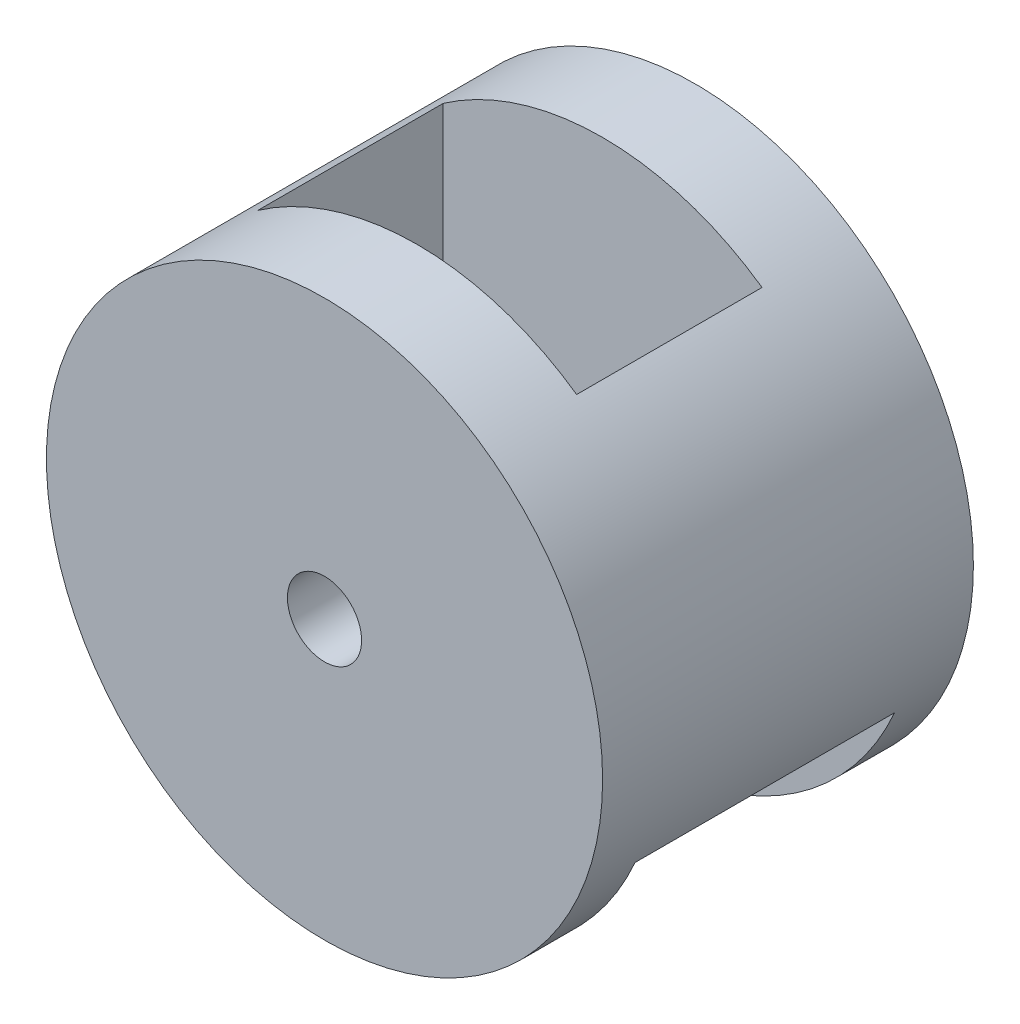
ISO-10303-21;
HEADER;
FILE_DESCRIPTION(('STEP AP214'),'2;1');
FILE_NAME('part.step','',(''),(''),'','','');
FILE_SCHEMA(('AUTOMOTIVE_DESIGN { 1 0 10303 214 1 1 1 1 }'));
ENDSEC;
DATA;
#1=APPLICATION_CONTEXT('core data for automotive mechanical design processes');
#2=APPLICATION_PROTOCOL_DEFINITION('international standard','automotive_design',2000,#1);
#3=PRODUCT_CONTEXT('',#1,'mechanical');
#4=PRODUCT('Part','Part','',(#3));
#5=PRODUCT_RELATED_PRODUCT_CATEGORY('part','',(#4));
#6=PRODUCT_DEFINITION_FORMATION('','',#4);
#7=PRODUCT_DEFINITION_CONTEXT('part definition',#1,'design');
#8=PRODUCT_DEFINITION('design','',#6,#7);
#9=PRODUCT_DEFINITION_SHAPE('','',#8);
#10=(LENGTH_UNIT() NAMED_UNIT(*) SI_UNIT(.MILLI.,.METRE.));
#11=(NAMED_UNIT(*) PLANE_ANGLE_UNIT() SI_UNIT($,.RADIAN.));
#12=(NAMED_UNIT(*) SI_UNIT($,.STERADIAN.) SOLID_ANGLE_UNIT());
#13=UNCERTAINTY_MEASURE_WITH_UNIT(LENGTH_MEASURE(1.E-05),#10,'distance_accuracy_value','');
#14=(GEOMETRIC_REPRESENTATION_CONTEXT(3) GLOBAL_UNCERTAINTY_ASSIGNED_CONTEXT((#13)) GLOBAL_UNIT_ASSIGNED_CONTEXT((#10,
#11,#12)) REPRESENTATION_CONTEXT('',''));
#15=CARTESIAN_POINT('',(0.,0.,0.));
#16=DIRECTION('',(0.,0.,1.));
#17=DIRECTION('',(1.,0.,0.));
#18=AXIS2_PLACEMENT_3D('',#15,#16,#17);
#19=CARTESIAN_POINT('',(0.,0.,10.));
#20=DIRECTION('',(0.,0.,-1.));
#21=DIRECTION('',(-1.,0.,0.));
#22=AXIS2_PLACEMENT_3D('',#19,#20,#21);
#23=CYLINDRICAL_SURFACE('',#22,7.5);
#24=CARTESIAN_POINT('',(0.,0.,7.5));
#25=DIRECTION('',(0.,0.,-1.));
#26=DIRECTION('',(-1.,0.,0.));
#27=AXIS2_PLACEMENT_3D('',#24,#25,#26);
#28=CIRCLE('',#27,7.5);
#29=CARTESIAN_POINT('',(-4.3,6.14491659829489,7.5));
#30=VERTEX_POINT('',#29);
#31=CARTESIAN_POINT('',(4.3,6.14491659829489,7.5));
#32=VERTEX_POINT('',#31);
#33=EDGE_CURVE('E153',#30,#32,#28,.T.);
#34=ORIENTED_EDGE('',*,*,#33,.F.);
#35=DIRECTION('',(0.,0.,-1.));
#36=VECTOR('',#35,1.);
#37=CARTESIAN_POINT('',(-4.3,6.14491659829489,7.5));
#38=LINE('',#37,#36);
#39=CARTESIAN_POINT('',(-4.3,6.14491659829489,2.5));
#40=VERTEX_POINT('',#39);
#41=EDGE_CURVE('E162',#30,#40,#38,.T.);
#42=ORIENTED_EDGE('',*,*,#41,.T.);
#43=CARTESIAN_POINT('',(0.,0.,2.5));
#44=DIRECTION('',(0.,0.,-1.));
#45=DIRECTION('',(-1.,0.,0.));
#46=AXIS2_PLACEMENT_3D('',#43,#44,#45);
#47=CIRCLE('',#46,7.5);
#48=CARTESIAN_POINT('',(4.3,6.14491659829489,2.5));
#49=VERTEX_POINT('',#48);
#50=EDGE_CURVE('E165',#40,#49,#47,.T.);
#51=ORIENTED_EDGE('',*,*,#50,.T.);
#52=DIRECTION('',(0.,0.,-1.));
#53=VECTOR('',#52,1.);
#54=CARTESIAN_POINT('',(4.3,6.14491659829489,7.5));
#55=LINE('',#54,#53);
#56=EDGE_CURVE('E175',#32,#49,#55,.T.);
#57=ORIENTED_EDGE('',*,*,#56,.F.);
#58=EDGE_LOOP('',(#34,#42,#51,#57));
#59=FACE_BOUND('',#58,.T.);
#60=CARTESIAN_POINT('',(0.,0.,10.));
#61=DIRECTION('',(0.,0.,1.));
#62=DIRECTION('',(1.,0.,0.));
#63=AXIS2_PLACEMENT_3D('',#60,#61,#62);
#64=CIRCLE('',#63,7.5);
#65=CARTESIAN_POINT('',(7.5,0.,10.));
#66=VERTEX_POINT('',#65);
#67=EDGE_CURVE('E11',#66,#66,#64,.T.);
#68=ORIENTED_EDGE('',*,*,#67,.F.);
#69=EDGE_LOOP('',(#68));
#70=FACE_BOUND('',#69,.T.);
#71=CARTESIAN_POINT('',(0.,0.,0.));
#72=DIRECTION('',(0.,0.,1.));
#73=DIRECTION('',(1.,0.,0.));
#74=AXIS2_PLACEMENT_3D('',#71,#72,#73);
#75=CIRCLE('',#74,7.5);
#76=CARTESIAN_POINT('',(7.5,0.,0.));
#77=VERTEX_POINT('',#76);
#78=EDGE_CURVE('E41',#77,#77,#75,.T.);
#79=ORIENTED_EDGE('',*,*,#78,.T.);
#80=EDGE_LOOP('',(#79));
#81=FACE_BOUND('',#80,.T.);
#82=CARTESIAN_POINT('',(0.,0.,8.5));
#83=DIRECTION('',(0.,0.,-1.));
#84=DIRECTION('',(-1.,0.,0.));
#85=AXIS2_PLACEMENT_3D('',#82,#83,#84);
#86=CIRCLE('',#85,7.5);
#87=CARTESIAN_POINT('',(6.87386354243376,-3.,8.5));
#88=VERTEX_POINT('',#87);
#89=CARTESIAN_POINT('',(-6.87386354243376,-3.,8.5));
#90=VERTEX_POINT('',#89);
#91=EDGE_CURVE('E120',#88,#90,#86,.T.);
#92=ORIENTED_EDGE('',*,*,#91,.F.);
#93=DIRECTION('',(0.,0.,-1.));
#94=VECTOR('',#93,1.);
#95=CARTESIAN_POINT('',(6.87386354243376,-3.,8.5));
#96=LINE('',#95,#94);
#97=CARTESIAN_POINT('',(6.87386354243376,-3.,1.5));
#98=VERTEX_POINT('',#97);
#99=EDGE_CURVE('E111',#88,#98,#96,.T.);
#100=ORIENTED_EDGE('',*,*,#99,.T.);
#101=CARTESIAN_POINT('',(0.,0.,1.5));
#102=DIRECTION('',(0.,0.,-1.));
#103=DIRECTION('',(-1.,0.,0.));
#104=AXIS2_PLACEMENT_3D('',#101,#102,#103);
#105=CIRCLE('',#104,7.5);
#106=CARTESIAN_POINT('',(-6.87386354243376,-3.,1.5));
#107=VERTEX_POINT('',#106);
#108=EDGE_CURVE('E125',#98,#107,#105,.T.);
#109=ORIENTED_EDGE('',*,*,#108,.T.);
#110=DIRECTION('',(0.,0.,-1.));
#111=VECTOR('',#110,1.);
#112=CARTESIAN_POINT('',(-6.87386354243376,-3.,8.5));
#113=LINE('',#112,#111);
#114=EDGE_CURVE('E138',#90,#107,#113,.T.);
#115=ORIENTED_EDGE('',*,*,#114,.F.);
#116=EDGE_LOOP('',(#92,#100,#109,#115));
#117=FACE_BOUND('',#116,.T.);
#118=ADVANCED_FACE('F33',(#59,#70,#81,#117),#23,.T.);
#119=CARTESIAN_POINT('',(0.,0.,10.));
#120=DIRECTION('',(0.,0.,1.));
#121=DIRECTION('',(1.,0.,0.));
#122=AXIS2_PLACEMENT_3D('',#119,#120,#121);
#123=PLANE('',#122);
#124=CARTESIAN_POINT('',(0.,0.,10.));
#125=DIRECTION('',(0.,0.,-1.));
#126=DIRECTION('',(-1.,0.,0.));
#127=AXIS2_PLACEMENT_3D('',#124,#125,#126);
#128=CIRCLE('',#127,1.);
#129=CARTESIAN_POINT('',(-1.,0.,10.));
#130=VERTEX_POINT('',#129);
#131=EDGE_CURVE('E141',#130,#130,#128,.T.);
#132=ORIENTED_EDGE('',*,*,#131,.T.);
#133=EDGE_LOOP('',(#132));
#134=FACE_BOUND('',#133,.T.);
#135=ORIENTED_EDGE('',*,*,#67,.T.);
#136=EDGE_LOOP('',(#135));
#137=FACE_BOUND('',#136,.T.);
#138=ADVANCED_FACE('F186',(#134,#137),#123,.T.);
#139=CARTESIAN_POINT('',(0.,0.,0.));
#140=DIRECTION('',(0.,0.,1.));
#141=DIRECTION('',(1.,0.,0.));
#142=AXIS2_PLACEMENT_3D('',#139,#140,#141);
#143=PLANE('',#142);
#144=CARTESIAN_POINT('',(0.,0.,0.));
#145=DIRECTION('',(0.,0.,-1.));
#146=DIRECTION('',(-1.,0.,0.));
#147=AXIS2_PLACEMENT_3D('',#144,#145,#146);
#148=CIRCLE('',#147,1.);
#149=CARTESIAN_POINT('',(-1.,0.,0.));
#150=VERTEX_POINT('',#149);
#151=EDGE_CURVE('E137',#150,#150,#148,.T.);
#152=ORIENTED_EDGE('',*,*,#151,.F.);
#153=EDGE_LOOP('',(#152));
#154=FACE_BOUND('',#153,.T.);
#155=ORIENTED_EDGE('',*,*,#78,.F.);
#156=EDGE_LOOP('',(#155));
#157=FACE_BOUND('',#156,.T.);
#158=ADVANCED_FACE('F183',(#154,#157),#143,.F.);
#159=CARTESIAN_POINT('',(-4.3,0.,7.5));
#160=DIRECTION('',(-1.,0.,0.));
#161=DIRECTION('',(0.,0.,1.));
#162=AXIS2_PLACEMENT_3D('',#159,#160,#161);
#163=PLANE('',#162);
#164=DIRECTION('',(0.,1.,0.));
#165=VECTOR('',#164,1.);
#166=CARTESIAN_POINT('',(-4.3,0.,2.5));
#167=LINE('',#166,#165);
#168=CARTESIAN_POINT('',(-4.3,0.,2.5));
#169=VERTEX_POINT('',#168);
#170=EDGE_CURVE('E149',#169,#40,#167,.T.);
#171=ORIENTED_EDGE('',*,*,#170,.T.);
#172=ORIENTED_EDGE('',*,*,#41,.F.);
#173=DIRECTION('',(0.,1.,0.));
#174=VECTOR('',#173,1.);
#175=CARTESIAN_POINT('',(-4.3,0.,7.5));
#176=LINE('',#175,#174);
#177=CARTESIAN_POINT('',(-4.3,0.,7.5));
#178=VERTEX_POINT('',#177);
#179=EDGE_CURVE('E150',#178,#30,#176,.T.);
#180=ORIENTED_EDGE('',*,*,#179,.F.);
#181=DIRECTION('',(0.,0.,-1.));
#182=VECTOR('',#181,1.);
#183=CARTESIAN_POINT('',(-4.3,0.,7.5));
#184=LINE('',#183,#182);
#185=EDGE_CURVE('E171',#178,#169,#184,.T.);
#186=ORIENTED_EDGE('',*,*,#185,.T.);
#187=EDGE_LOOP('',(#171,#172,#180,#186));
#188=FACE_BOUND('',#187,.T.);
#189=ADVANCED_FACE('F185',(#188),#163,.F.);
#190=CARTESIAN_POINT('',(0.,0.,7.5));
#191=DIRECTION('',(0.,0.,-1.));
#192=DIRECTION('',(-1.,0.,0.));
#193=AXIS2_PLACEMENT_3D('',#190,#191,#192);
#194=CYLINDRICAL_SURFACE('',#193,4.3);
#195=CARTESIAN_POINT('',(0.,0.,2.5));
#196=DIRECTION('',(0.,0.,-1.));
#197=DIRECTION('',(-1.,0.,0.));
#198=AXIS2_PLACEMENT_3D('',#195,#196,#197);
#199=CIRCLE('',#198,4.3);
#200=CARTESIAN_POINT('',(4.3,0.,2.5));
#201=VERTEX_POINT('',#200);
#202=EDGE_CURVE('E154',#201,#169,#199,.T.);
#203=ORIENTED_EDGE('',*,*,#202,.T.);
#204=ORIENTED_EDGE('',*,*,#185,.F.);
#205=CARTESIAN_POINT('',(0.,0.,7.5));
#206=DIRECTION('',(0.,0.,-1.));
#207=DIRECTION('',(-1.,0.,0.));
#208=AXIS2_PLACEMENT_3D('',#205,#206,#207);
#209=CIRCLE('',#208,4.3);
#210=CARTESIAN_POINT('',(4.3,0.,7.5));
#211=VERTEX_POINT('',#210);
#212=EDGE_CURVE('E159',#211,#178,#209,.T.);
#213=ORIENTED_EDGE('',*,*,#212,.F.);
#214=DIRECTION('',(0.,0.,-1.));
#215=VECTOR('',#214,1.);
#216=CARTESIAN_POINT('',(4.3,0.,7.5));
#217=LINE('',#216,#215);
#218=EDGE_CURVE('E173',#211,#201,#217,.T.);
#219=ORIENTED_EDGE('',*,*,#218,.T.);
#220=EDGE_LOOP('',(#203,#204,#213,#219));
#221=FACE_BOUND('',#220,.T.);
#222=ADVANCED_FACE('F192',(#221),#194,.F.);
#223=CARTESIAN_POINT('',(4.3,0.,7.5));
#224=DIRECTION('',(-1.,0.,0.));
#225=DIRECTION('',(0.,0.,1.));
#226=AXIS2_PLACEMENT_3D('',#223,#224,#225);
#227=PLANE('',#226);
#228=DIRECTION('',(0.,1.,0.));
#229=VECTOR('',#228,1.);
#230=CARTESIAN_POINT('',(4.3,0.,2.5));
#231=LINE('',#230,#229);
#232=EDGE_CURVE('E57',#201,#49,#231,.T.);
#233=ORIENTED_EDGE('',*,*,#232,.F.);
#234=ORIENTED_EDGE('',*,*,#218,.F.);
#235=DIRECTION('',(0.,1.,0.));
#236=VECTOR('',#235,1.);
#237=CARTESIAN_POINT('',(4.3,0.,7.5));
#238=LINE('',#237,#236);
#239=EDGE_CURVE('E157',#211,#32,#238,.T.);
#240=ORIENTED_EDGE('',*,*,#239,.T.);
#241=ORIENTED_EDGE('',*,*,#56,.T.);
#242=EDGE_LOOP('',(#233,#234,#240,#241));
#243=FACE_BOUND('',#242,.T.);
#244=ADVANCED_FACE('F216',(#243),#227,.T.);
#245=CARTESIAN_POINT('',(0.,0.,7.5));
#246=DIRECTION('',(0.,0.,-1.));
#247=DIRECTION('',(-1.,0.,0.));
#248=AXIS2_PLACEMENT_3D('',#245,#246,#247);
#249=PLANE('',#248);
#250=CARTESIAN_POINT('',(0.,0.,7.5));
#251=DIRECTION('',(0.,0.,-1.));
#252=DIRECTION('',(-1.,0.,0.));
#253=AXIS2_PLACEMENT_3D('',#250,#251,#252);
#254=CIRCLE('',#253,1.);
#255=CARTESIAN_POINT('',(-1.,0.,7.5));
#256=VERTEX_POINT('',#255);
#257=EDGE_CURVE('E146',#256,#256,#254,.T.);
#258=ORIENTED_EDGE('',*,*,#257,.F.);
#259=EDGE_LOOP('',(#258));
#260=FACE_BOUND('',#259,.T.);
#261=ORIENTED_EDGE('',*,*,#179,.T.);
#262=ORIENTED_EDGE('',*,*,#33,.T.);
#263=ORIENTED_EDGE('',*,*,#239,.F.);
#264=ORIENTED_EDGE('',*,*,#212,.T.);
#265=EDGE_LOOP('',(#261,#262,#263,#264));
#266=FACE_BOUND('',#265,.T.);
#267=ADVANCED_FACE('F209',(#260,#266),#249,.T.);
#268=CARTESIAN_POINT('',(0.,0.,2.5));
#269=DIRECTION('',(0.,0.,-1.));
#270=DIRECTION('',(-1.,0.,0.));
#271=AXIS2_PLACEMENT_3D('',#268,#269,#270);
#272=PLANE('',#271);
#273=CARTESIAN_POINT('',(0.,0.,2.5));
#274=DIRECTION('',(0.,0.,-1.));
#275=DIRECTION('',(-1.,0.,0.));
#276=AXIS2_PLACEMENT_3D('',#273,#274,#275);
#277=CIRCLE('',#276,1.);
#278=CARTESIAN_POINT('',(-1.,0.,2.5));
#279=VERTEX_POINT('',#278);
#280=EDGE_CURVE('E36',#279,#279,#277,.T.);
#281=ORIENTED_EDGE('',*,*,#280,.T.);
#282=EDGE_LOOP('',(#281));
#283=FACE_BOUND('',#282,.T.);
#284=ORIENTED_EDGE('',*,*,#170,.F.);
#285=ORIENTED_EDGE('',*,*,#202,.F.);
#286=ORIENTED_EDGE('',*,*,#232,.T.);
#287=ORIENTED_EDGE('',*,*,#50,.F.);
#288=EDGE_LOOP('',(#284,#285,#286,#287));
#289=FACE_BOUND('',#288,.T.);
#290=ADVANCED_FACE('F213',(#283,#289),#272,.F.);
#291=CARTESIAN_POINT('',(0.,0.,10.));
#292=DIRECTION('',(0.,0.,-1.));
#293=DIRECTION('',(-1.,0.,0.));
#294=AXIS2_PLACEMENT_3D('',#291,#292,#293);
#295=CYLINDRICAL_SURFACE('',#294,1.);
#296=ORIENTED_EDGE('',*,*,#151,.T.);
#297=EDGE_LOOP('',(#296));
#298=FACE_BOUND('',#297,.T.);
#299=ORIENTED_EDGE('',*,*,#280,.F.);
#300=EDGE_LOOP('',(#299));
#301=FACE_BOUND('',#300,.T.);
#302=ADVANCED_FACE('F228',(#298,#301),#295,.F.);
#303=ORIENTED_EDGE('',*,*,#257,.T.);
#304=EDGE_LOOP('',(#303));
#305=FACE_BOUND('',#304,.T.);
#306=ORIENTED_EDGE('',*,*,#131,.F.);
#307=EDGE_LOOP('',(#306));
#308=FACE_BOUND('',#307,.T.);
#309=ADVANCED_FACE('F231',(#305,#308),#295,.F.);
#310=CARTESIAN_POINT('',(0.,0.,8.5));
#311=DIRECTION('',(0.,0.,-1.));
#312=DIRECTION('',(-1.,0.,0.));
#313=AXIS2_PLACEMENT_3D('',#310,#311,#312);
#314=CYLINDRICAL_SURFACE('',#313,6.5);
#315=CARTESIAN_POINT('',(0.,0.,1.5));
#316=DIRECTION('',(0.,0.,1.));
#317=DIRECTION('',(-1.,0.,0.));
#318=AXIS2_PLACEMENT_3D('',#315,#316,#317);
#319=CIRCLE('',#318,6.5);
#320=CARTESIAN_POINT('',(-5.7662812973354,-3.,1.5));
#321=VERTEX_POINT('',#320);
#322=CARTESIAN_POINT('',(5.7662812973354,-3.,1.5));
#323=VERTEX_POINT('',#322);
#324=EDGE_CURVE('E107',#321,#323,#319,.T.);
#325=ORIENTED_EDGE('',*,*,#324,.T.);
#326=DIRECTION('',(0.,0.,-1.));
#327=VECTOR('',#326,1.);
#328=CARTESIAN_POINT('',(5.7662812973354,-3.,8.5));
#329=LINE('',#328,#327);
#330=CARTESIAN_POINT('',(5.7662812973354,-3.,8.5));
#331=VERTEX_POINT('',#330);
#332=EDGE_CURVE('E101',#331,#323,#329,.T.);
#333=ORIENTED_EDGE('',*,*,#332,.F.);
#334=CARTESIAN_POINT('',(0.,0.,8.5));
#335=DIRECTION('',(0.,0.,1.));
#336=DIRECTION('',(-1.,0.,0.));
#337=AXIS2_PLACEMENT_3D('',#334,#335,#336);
#338=CIRCLE('',#337,6.5);
#339=CARTESIAN_POINT('',(-5.7662812973354,-3.,8.5));
#340=VERTEX_POINT('',#339);
#341=EDGE_CURVE('E105',#340,#331,#338,.T.);
#342=ORIENTED_EDGE('',*,*,#341,.F.);
#343=DIRECTION('',(0.,0.,-1.));
#344=VECTOR('',#343,1.);
#345=CARTESIAN_POINT('',(-5.7662812973354,-3.,8.5));
#346=LINE('',#345,#344);
#347=EDGE_CURVE('E135',#340,#321,#346,.T.);
#348=ORIENTED_EDGE('',*,*,#347,.T.);
#349=EDGE_LOOP('',(#325,#333,#342,#348));
#350=FACE_BOUND('',#349,.T.);
#351=ADVANCED_FACE('F103',(#350),#314,.T.);
#352=CARTESIAN_POINT('',(-5.7662812973354,-3.,8.5));
#353=DIRECTION('',(0.,1.,0.));
#354=DIRECTION('',(-1.,0.,0.));
#355=AXIS2_PLACEMENT_3D('',#352,#353,#354);
#356=PLANE('',#355);
#357=DIRECTION('',(1.,0.,0.));
#358=VECTOR('',#357,1.);
#359=CARTESIAN_POINT('',(-5.7662812973354,-3.,1.5));
#360=LINE('',#359,#358);
#361=EDGE_CURVE('E49',#107,#321,#360,.T.);
#362=ORIENTED_EDGE('',*,*,#361,.T.);
#363=ORIENTED_EDGE('',*,*,#347,.F.);
#364=DIRECTION('',(1.,0.,0.));
#365=VECTOR('',#364,1.);
#366=CARTESIAN_POINT('',(-5.7662812973354,-3.,8.5));
#367=LINE('',#366,#365);
#368=EDGE_CURVE('E112',#90,#340,#367,.T.);
#369=ORIENTED_EDGE('',*,*,#368,.F.);
#370=ORIENTED_EDGE('',*,*,#114,.T.);
#371=EDGE_LOOP('',(#362,#363,#369,#370));
#372=FACE_BOUND('',#371,.T.);
#373=ADVANCED_FACE('F237',(#372),#356,.F.);
#374=CARTESIAN_POINT('',(5.7662812973354,-3.,8.5));
#375=DIRECTION('',(0.,1.,0.));
#376=DIRECTION('',(0.,0.,1.));
#377=AXIS2_PLACEMENT_3D('',#374,#375,#376);
#378=PLANE('',#377);
#379=DIRECTION('',(1.,0.,0.));
#380=VECTOR('',#379,1.);
#381=CARTESIAN_POINT('',(5.7662812973354,-3.,1.5));
#382=LINE('',#381,#380);
#383=EDGE_CURVE('E131',#323,#98,#382,.T.);
#384=ORIENTED_EDGE('',*,*,#383,.T.);
#385=ORIENTED_EDGE('',*,*,#99,.F.);
#386=DIRECTION('',(1.,0.,0.));
#387=VECTOR('',#386,1.);
#388=CARTESIAN_POINT('',(5.7662812973354,-3.,8.5));
#389=LINE('',#388,#387);
#390=EDGE_CURVE('E115',#331,#88,#389,.T.);
#391=ORIENTED_EDGE('',*,*,#390,.F.);
#392=ORIENTED_EDGE('',*,*,#332,.T.);
#393=EDGE_LOOP('',(#384,#385,#391,#392));
#394=FACE_BOUND('',#393,.T.);
#395=ADVANCED_FACE('F116',(#394),#378,.F.);
#396=CARTESIAN_POINT('',(0.,0.,8.5));
#397=DIRECTION('',(0.,0.,-1.));
#398=DIRECTION('',(-1.,0.,0.));
#399=AXIS2_PLACEMENT_3D('',#396,#397,#398);
#400=PLANE('',#399);
#401=ORIENTED_EDGE('',*,*,#341,.T.);
#402=ORIENTED_EDGE('',*,*,#390,.T.);
#403=ORIENTED_EDGE('',*,*,#91,.T.);
#404=ORIENTED_EDGE('',*,*,#368,.T.);
#405=EDGE_LOOP('',(#401,#402,#403,#404));
#406=FACE_BOUND('',#405,.T.);
#407=ADVANCED_FACE('F122',(#406),#400,.T.);
#408=CARTESIAN_POINT('',(0.,0.,1.5));
#409=DIRECTION('',(0.,0.,-1.));
#410=DIRECTION('',(-1.,0.,0.));
#411=AXIS2_PLACEMENT_3D('',#408,#409,#410);
#412=PLANE('',#411);
#413=ORIENTED_EDGE('',*,*,#324,.F.);
#414=ORIENTED_EDGE('',*,*,#361,.F.);
#415=ORIENTED_EDGE('',*,*,#108,.F.);
#416=ORIENTED_EDGE('',*,*,#383,.F.);
#417=EDGE_LOOP('',(#413,#414,#415,#416));
#418=FACE_BOUND('',#417,.T.);
#419=ADVANCED_FACE('F243',(#418),#412,.F.);
#420=CLOSED_SHELL('',(#118,#138,#158,#189,#222,#244,#267,#290,#302,#309,#351,#373,#395,#407,#419));
#421=MANIFOLD_SOLID_BREP('B2',#420);
#422=ADVANCED_BREP_SHAPE_REPRESENTATION('',(#18,#421),#14);
#423=SHAPE_DEFINITION_REPRESENTATION(#9,#422);
ENDSEC;
END-ISO-10303-21;
